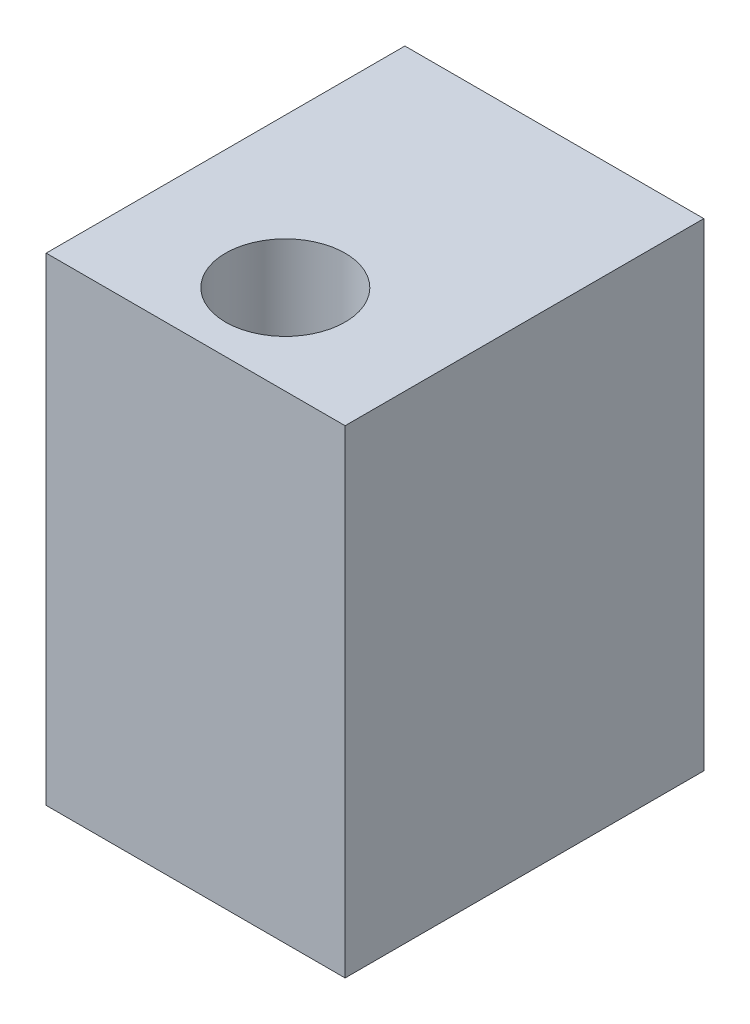
ISO-10303-21;
HEADER;
FILE_DESCRIPTION(('STEP AP214'),'2;1');
FILE_NAME('part.step','',(''),(''),'','','');
FILE_SCHEMA(('AUTOMOTIVE_DESIGN { 1 0 10303 214 1 1 1 1 }'));
ENDSEC;
DATA;
#1=APPLICATION_CONTEXT('core data for automotive mechanical design processes');
#2=APPLICATION_PROTOCOL_DEFINITION('international standard','automotive_design',2000,#1);
#3=PRODUCT_CONTEXT('',#1,'mechanical');
#4=PRODUCT('Part','Part','',(#3));
#5=PRODUCT_RELATED_PRODUCT_CATEGORY('part','',(#4));
#6=PRODUCT_DEFINITION_FORMATION('','',#4);
#7=PRODUCT_DEFINITION_CONTEXT('part definition',#1,'design');
#8=PRODUCT_DEFINITION('design','',#6,#7);
#9=PRODUCT_DEFINITION_SHAPE('','',#8);
#10=(LENGTH_UNIT() NAMED_UNIT(*) SI_UNIT(.MILLI.,.METRE.));
#11=(NAMED_UNIT(*) PLANE_ANGLE_UNIT() SI_UNIT($,.RADIAN.));
#12=(NAMED_UNIT(*) SI_UNIT($,.STERADIAN.) SOLID_ANGLE_UNIT());
#13=UNCERTAINTY_MEASURE_WITH_UNIT(LENGTH_MEASURE(1.E-05),#10,'distance_accuracy_value','');
#14=(GEOMETRIC_REPRESENTATION_CONTEXT(3) GLOBAL_UNCERTAINTY_ASSIGNED_CONTEXT((#13)) GLOBAL_UNIT_ASSIGNED_CONTEXT((#10,
#11,#12)) REPRESENTATION_CONTEXT('',''));
#15=CARTESIAN_POINT('',(0.,0.,0.));
#16=DIRECTION('',(0.,0.,1.));
#17=DIRECTION('',(1.,0.,0.));
#18=AXIS2_PLACEMENT_3D('',#15,#16,#17);
#19=CARTESIAN_POINT('',(0.,0.,3.));
#20=DIRECTION('',(0.,1.,0.));
#21=DIRECTION('',(0.,0.,1.));
#22=AXIS2_PLACEMENT_3D('',#19,#20,#21);
#23=CYLINDRICAL_SURFACE('',#22,1.5);
#24=CARTESIAN_POINT('',(0.,0.,3.));
#25=DIRECTION('',(0.,1.,0.));
#26=DIRECTION('',(0.,0.,1.));
#27=AXIS2_PLACEMENT_3D('',#24,#25,#26);
#28=CIRCLE('',#27,1.5);
#29=CARTESIAN_POINT('',(0.,0.,4.5));
#30=VERTEX_POINT('',#29);
#31=EDGE_CURVE('E117',#30,#30,#28,.T.);
#32=ORIENTED_EDGE('',*,*,#31,.F.);
#33=EDGE_LOOP('',(#32));
#34=FACE_BOUND('',#33,.T.);
#35=CARTESIAN_POINT('',(0.,8.,3.));
#36=DIRECTION('',(0.,1.,0.));
#37=DIRECTION('',(0.,0.,1.));
#38=AXIS2_PLACEMENT_3D('',#35,#36,#37);
#39=CIRCLE('',#38,1.5);
#40=CARTESIAN_POINT('',(0.,8.,4.5));
#41=VERTEX_POINT('',#40);
#42=EDGE_CURVE('E47',#41,#41,#39,.F.);
#43=ORIENTED_EDGE('',*,*,#42,.F.);
#44=EDGE_LOOP('',(#43));
#45=FACE_BOUND('',#44,.T.);
#46=ADVANCED_FACE('F43',(#34,#45),#23,.F.);
#47=CARTESIAN_POINT('',(-5.,16.,6.));
#48=DIRECTION('',(0.,0.,-1.));
#49=DIRECTION('',(-1.,0.,0.));
#50=AXIS2_PLACEMENT_3D('',#47,#48,#49);
#51=PLANE('',#50);
#52=DIRECTION('',(1.,0.,0.));
#53=VECTOR('',#52,1.);
#54=CARTESIAN_POINT('',(-5.,0.,6.));
#55=LINE('',#54,#53);
#56=CARTESIAN_POINT('',(-5.,0.,6.));
#57=VERTEX_POINT('',#56);
#58=CARTESIAN_POINT('',(5.,0.,6.));
#59=VERTEX_POINT('',#58);
#60=EDGE_CURVE('E114',#57,#59,#55,.T.);
#61=ORIENTED_EDGE('',*,*,#60,.T.);
#62=DIRECTION('',(0.,-1.,0.));
#63=VECTOR('',#62,1.);
#64=CARTESIAN_POINT('',(5.,16.,6.));
#65=LINE('',#64,#63);
#66=CARTESIAN_POINT('',(5.,16.,6.));
#67=VERTEX_POINT('',#66);
#68=EDGE_CURVE('E11',#67,#59,#65,.T.);
#69=ORIENTED_EDGE('',*,*,#68,.F.);
#70=DIRECTION('',(1.,0.,0.));
#71=VECTOR('',#70,1.);
#72=CARTESIAN_POINT('',(-5.,16.,6.));
#73=LINE('',#72,#71);
#74=CARTESIAN_POINT('',(-5.,16.,6.));
#75=VERTEX_POINT('',#74);
#76=EDGE_CURVE('E95',#75,#67,#73,.T.);
#77=ORIENTED_EDGE('',*,*,#76,.F.);
#78=DIRECTION('',(0.,-1.,0.));
#79=VECTOR('',#78,1.);
#80=CARTESIAN_POINT('',(-5.,16.,6.));
#81=LINE('',#80,#79);
#82=EDGE_CURVE('E62',#75,#57,#81,.T.);
#83=ORIENTED_EDGE('',*,*,#82,.T.);
#84=EDGE_LOOP('',(#61,#69,#77,#83));
#85=FACE_BOUND('',#84,.T.);
#86=ADVANCED_FACE('F45',(#85),#51,.F.);
#87=CARTESIAN_POINT('',(5.,16.,6.));
#88=DIRECTION('',(-1.,0.,0.));
#89=DIRECTION('',(0.,0.,1.));
#90=AXIS2_PLACEMENT_3D('',#87,#88,#89);
#91=PLANE('',#90);
#92=DIRECTION('',(0.,0.,-1.));
#93=VECTOR('',#92,1.);
#94=CARTESIAN_POINT('',(5.,0.,6.));
#95=LINE('',#94,#93);
#96=CARTESIAN_POINT('',(5.,0.,-6.));
#97=VERTEX_POINT('',#96);
#98=EDGE_CURVE('E101',#59,#97,#95,.T.);
#99=ORIENTED_EDGE('',*,*,#98,.T.);
#100=DIRECTION('',(0.,-1.,0.));
#101=VECTOR('',#100,1.);
#102=CARTESIAN_POINT('',(5.,16.,-6.));
#103=LINE('',#102,#101);
#104=CARTESIAN_POINT('',(5.,16.,-6.));
#105=VERTEX_POINT('',#104);
#106=EDGE_CURVE('E54',#105,#97,#103,.T.);
#107=ORIENTED_EDGE('',*,*,#106,.F.);
#108=DIRECTION('',(0.,0.,-1.));
#109=VECTOR('',#108,1.);
#110=CARTESIAN_POINT('',(5.,16.,6.));
#111=LINE('',#110,#109);
#112=EDGE_CURVE('E87',#67,#105,#111,.T.);
#113=ORIENTED_EDGE('',*,*,#112,.F.);
#114=ORIENTED_EDGE('',*,*,#68,.T.);
#115=EDGE_LOOP('',(#99,#107,#113,#114));
#116=FACE_BOUND('',#115,.T.);
#117=ADVANCED_FACE('F100',(#116),#91,.F.);
#118=CARTESIAN_POINT('',(-5.,16.,-6.));
#119=DIRECTION('',(0.,0.,-1.));
#120=DIRECTION('',(-1.,0.,0.));
#121=AXIS2_PLACEMENT_3D('',#118,#119,#120);
#122=PLANE('',#121);
#123=DIRECTION('',(1.,0.,0.));
#124=VECTOR('',#123,1.);
#125=CARTESIAN_POINT('',(-5.,0.,-6.));
#126=LINE('',#125,#124);
#127=CARTESIAN_POINT('',(-5.,0.,-6.));
#128=VERTEX_POINT('',#127);
#129=EDGE_CURVE('E120',#128,#97,#126,.T.);
#130=ORIENTED_EDGE('',*,*,#129,.F.);
#131=DIRECTION('',(0.,-1.,0.));
#132=VECTOR('',#131,1.);
#133=CARTESIAN_POINT('',(-5.,16.,-6.));
#134=LINE('',#133,#132);
#135=CARTESIAN_POINT('',(-5.,16.,-6.));
#136=VERTEX_POINT('',#135);
#137=EDGE_CURVE('E76',#136,#128,#134,.T.);
#138=ORIENTED_EDGE('',*,*,#137,.F.);
#139=DIRECTION('',(1.,0.,0.));
#140=VECTOR('',#139,1.);
#141=CARTESIAN_POINT('',(-5.,16.,-6.));
#142=LINE('',#141,#140);
#143=EDGE_CURVE('E94',#136,#105,#142,.T.);
#144=ORIENTED_EDGE('',*,*,#143,.T.);
#145=ORIENTED_EDGE('',*,*,#106,.T.);
#146=EDGE_LOOP('',(#130,#138,#144,#145));
#147=FACE_BOUND('',#146,.T.);
#148=ADVANCED_FACE('F106',(#147),#122,.T.);
#149=CARTESIAN_POINT('',(-5.,16.,6.));
#150=DIRECTION('',(-1.,0.,0.));
#151=DIRECTION('',(0.,0.,1.));
#152=AXIS2_PLACEMENT_3D('',#149,#150,#151);
#153=PLANE('',#152);
#154=DIRECTION('',(0.,0.,-1.));
#155=VECTOR('',#154,1.);
#156=CARTESIAN_POINT('',(-5.,0.,6.));
#157=LINE('',#156,#155);
#158=EDGE_CURVE('E123',#57,#128,#157,.T.);
#159=ORIENTED_EDGE('',*,*,#158,.F.);
#160=ORIENTED_EDGE('',*,*,#82,.F.);
#161=DIRECTION('',(0.,0.,-1.));
#162=VECTOR('',#161,1.);
#163=CARTESIAN_POINT('',(-5.,16.,6.));
#164=LINE('',#163,#162);
#165=EDGE_CURVE('E108',#75,#136,#164,.T.);
#166=ORIENTED_EDGE('',*,*,#165,.T.);
#167=ORIENTED_EDGE('',*,*,#137,.T.);
#168=EDGE_LOOP('',(#159,#160,#166,#167));
#169=FACE_BOUND('',#168,.T.);
#170=ADVANCED_FACE('F165',(#169),#153,.T.);
#171=CARTESIAN_POINT('',(0.,16.,0.));
#172=DIRECTION('',(0.,1.,0.));
#173=DIRECTION('',(0.,0.,1.));
#174=AXIS2_PLACEMENT_3D('',#171,#172,#173);
#175=PLANE('',#174);
#176=CARTESIAN_POINT('',(0.,16.,3.));
#177=DIRECTION('',(0.,1.,0.));
#178=DIRECTION('',(0.,0.,1.));
#179=AXIS2_PLACEMENT_3D('',#176,#177,#178);
#180=CIRCLE('',#179,2.);
#181=CARTESIAN_POINT('',(0.,16.,5.));
#182=VERTEX_POINT('',#181);
#183=EDGE_CURVE('E136',#182,#182,#180,.T.);
#184=ORIENTED_EDGE('',*,*,#183,.F.);
#185=EDGE_LOOP('',(#184));
#186=FACE_BOUND('',#185,.T.);
#187=ORIENTED_EDGE('',*,*,#76,.T.);
#188=ORIENTED_EDGE('',*,*,#112,.T.);
#189=ORIENTED_EDGE('',*,*,#143,.F.);
#190=ORIENTED_EDGE('',*,*,#165,.F.);
#191=EDGE_LOOP('',(#187,#188,#189,#190));
#192=FACE_BOUND('',#191,.T.);
#193=ADVANCED_FACE('F91',(#186,#192),#175,.T.);
#194=CARTESIAN_POINT('',(0.,0.,0.));
#195=DIRECTION('',(0.,1.,0.));
#196=DIRECTION('',(0.,0.,1.));
#197=AXIS2_PLACEMENT_3D('',#194,#195,#196);
#198=PLANE('',#197);
#199=ORIENTED_EDGE('',*,*,#31,.T.);
#200=EDGE_LOOP('',(#199));
#201=FACE_BOUND('',#200,.T.);
#202=ORIENTED_EDGE('',*,*,#60,.F.);
#203=ORIENTED_EDGE('',*,*,#158,.T.);
#204=ORIENTED_EDGE('',*,*,#129,.T.);
#205=ORIENTED_EDGE('',*,*,#98,.F.);
#206=EDGE_LOOP('',(#202,#203,#204,#205));
#207=FACE_BOUND('',#206,.T.);
#208=ADVANCED_FACE('F164',(#201,#207),#198,.F.);
#209=CARTESIAN_POINT('',(0.,8.,3.));
#210=DIRECTION('',(0.,1.,0.));
#211=DIRECTION('',(0.,0.,1.));
#212=AXIS2_PLACEMENT_3D('',#209,#210,#211);
#213=PLANE('',#212);
#214=CARTESIAN_POINT('',(0.,8.,3.));
#215=DIRECTION('',(0.,1.,0.));
#216=DIRECTION('',(0.,0.,1.));
#217=AXIS2_PLACEMENT_3D('',#214,#215,#216);
#218=CIRCLE('',#217,2.);
#219=CARTESIAN_POINT('',(0.,8.,5.));
#220=VERTEX_POINT('',#219);
#221=EDGE_CURVE('E140',#220,#220,#218,.T.);
#222=ORIENTED_EDGE('',*,*,#221,.T.);
#223=EDGE_LOOP('',(#222));
#224=FACE_BOUND('',#223,.T.);
#225=ORIENTED_EDGE('',*,*,#42,.T.);
#226=EDGE_LOOP('',(#225));
#227=FACE_BOUND('',#226,.T.);
#228=ADVANCED_FACE('F149',(#224,#227),#213,.T.);
#229=CARTESIAN_POINT('',(0.,8.,3.));
#230=DIRECTION('',(0.,1.,0.));
#231=DIRECTION('',(0.,0.,1.));
#232=AXIS2_PLACEMENT_3D('',#229,#230,#231);
#233=CYLINDRICAL_SURFACE('',#232,2.);
#234=ORIENTED_EDGE('',*,*,#221,.F.);
#235=EDGE_LOOP('',(#234));
#236=FACE_BOUND('',#235,.T.);
#237=ORIENTED_EDGE('',*,*,#183,.T.);
#238=EDGE_LOOP('',(#237));
#239=FACE_BOUND('',#238,.T.);
#240=ADVANCED_FACE('F160',(#236,#239),#233,.F.);
#241=CLOSED_SHELL('',(#46,#86,#117,#148,#170,#193,#208,#228,#240));
#242=MANIFOLD_SOLID_BREP('B2',#241);
#243=ADVANCED_BREP_SHAPE_REPRESENTATION('',(#18,#242),#14);
#244=SHAPE_DEFINITION_REPRESENTATION(#9,#243);
ENDSEC;
END-ISO-10303-21;
